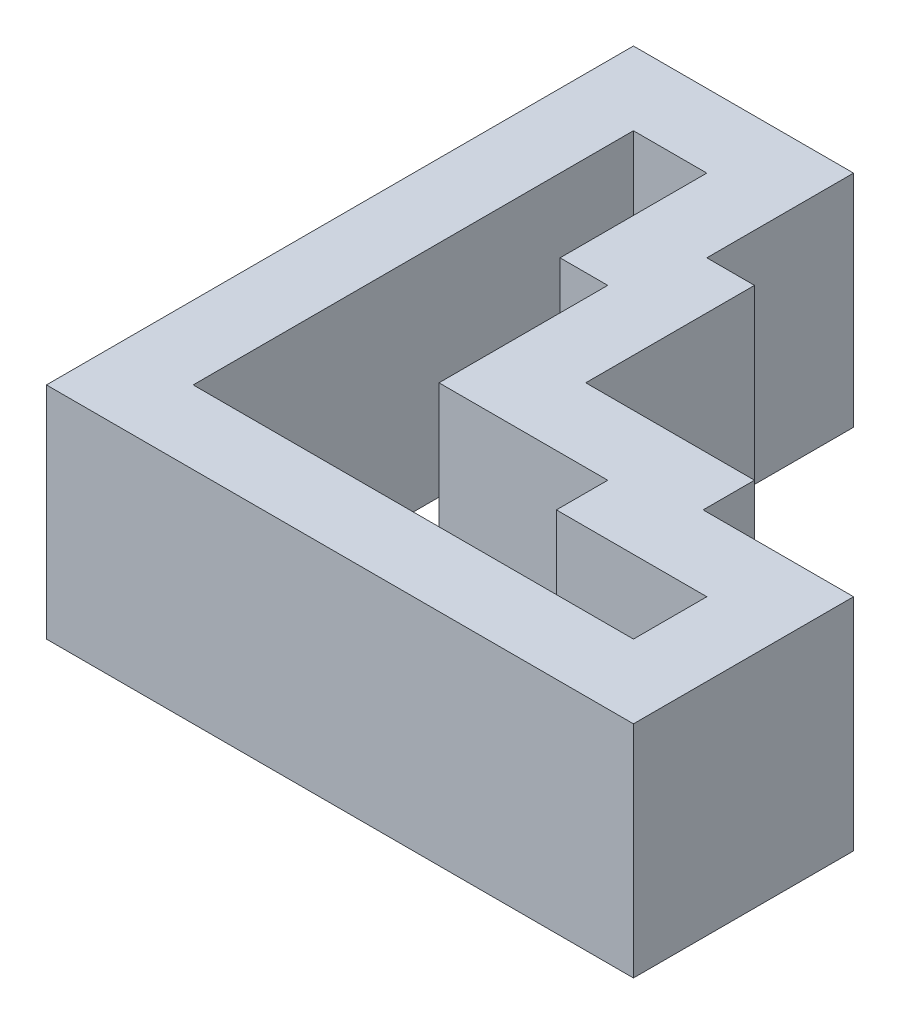
ISO-10303-21;
HEADER;
FILE_DESCRIPTION(('STEP AP214'),'2;1');
FILE_NAME('part.step','',(''),(''),'','','');
FILE_SCHEMA(('AUTOMOTIVE_DESIGN { 1 0 10303 214 1 1 1 1 }'));
ENDSEC;
DATA;
#1=APPLICATION_CONTEXT('core data for automotive mechanical design processes');
#2=APPLICATION_PROTOCOL_DEFINITION('international standard','automotive_design',2000,#1);
#3=PRODUCT_CONTEXT('',#1,'mechanical');
#4=PRODUCT('Part','Part','',(#3));
#5=PRODUCT_RELATED_PRODUCT_CATEGORY('part','',(#4));
#6=PRODUCT_DEFINITION_FORMATION('','',#4);
#7=PRODUCT_DEFINITION_CONTEXT('part definition',#1,'design');
#8=PRODUCT_DEFINITION('design','',#6,#7);
#9=PRODUCT_DEFINITION_SHAPE('','',#8);
#10=(LENGTH_UNIT() NAMED_UNIT(*) SI_UNIT(.MILLI.,.METRE.));
#11=(NAMED_UNIT(*) PLANE_ANGLE_UNIT() SI_UNIT($,.RADIAN.));
#12=(NAMED_UNIT(*) SI_UNIT($,.STERADIAN.) SOLID_ANGLE_UNIT());
#13=UNCERTAINTY_MEASURE_WITH_UNIT(LENGTH_MEASURE(1.E-05),#10,'distance_accuracy_value','');
#14=(GEOMETRIC_REPRESENTATION_CONTEXT(3) GLOBAL_UNCERTAINTY_ASSIGNED_CONTEXT((#13)) GLOBAL_UNIT_ASSIGNED_CONTEXT((#10,
#11,#12)) REPRESENTATION_CONTEXT('',''));
#15=CARTESIAN_POINT('',(0.,0.,0.));
#16=DIRECTION('',(0.,0.,1.));
#17=DIRECTION('',(1.,0.,0.));
#18=AXIS2_PLACEMENT_3D('',#15,#16,#17);
#19=CARTESIAN_POINT('',(0.,30.,0.));
#20=DIRECTION('',(0.,1.,0.));
#21=DIRECTION('',(0.,0.,1.));
#22=AXIS2_PLACEMENT_3D('',#19,#20,#21);
#23=PLANE('',#22);
#24=DIRECTION('',(0.,0.,1.));
#25=VECTOR('',#24,1.);
#26=CARTESIAN_POINT('',(-10.,30.,-60.));
#27=LINE('',#26,#25);
#28=CARTESIAN_POINT('',(-10.,30.,-70.));
#29=VERTEX_POINT('',#28);
#30=CARTESIAN_POINT('',(-10.,30.,10.));
#31=VERTEX_POINT('',#30);
#32=EDGE_CURVE('E314',#29,#31,#27,.T.);
#33=ORIENTED_EDGE('',*,*,#32,.T.);
#34=DIRECTION('',(1.,0.,0.));
#35=VECTOR('',#34,1.);
#36=CARTESIAN_POINT('',(0.,30.,10.));
#37=LINE('',#36,#35);
#38=CARTESIAN_POINT('',(70.,30.,10.));
#39=VERTEX_POINT('',#38);
#40=EDGE_CURVE('E317',#31,#39,#37,.T.);
#41=ORIENTED_EDGE('',*,*,#40,.T.);
#42=DIRECTION('',(0.,0.,-1.));
#43=VECTOR('',#42,1.);
#44=CARTESIAN_POINT('',(70.,30.,0.));
#45=LINE('',#44,#43);
#46=CARTESIAN_POINT('',(70.,30.,-20.));
#47=VERTEX_POINT('',#46);
#48=EDGE_CURVE('E320',#39,#47,#45,.T.);
#49=ORIENTED_EDGE('',*,*,#48,.T.);
#50=DIRECTION('',(-1.,0.,0.));
#51=VECTOR('',#50,1.);
#52=CARTESIAN_POINT('',(60.,30.,-20.));
#53=LINE('',#52,#51);
#54=CARTESIAN_POINT('',(49.5,30.,-20.));
#55=VERTEX_POINT('',#54);
#56=EDGE_CURVE('E322',#47,#55,#53,.T.);
#57=ORIENTED_EDGE('',*,*,#56,.T.);
#58=DIRECTION('',(0.,0.,-1.));
#59=VECTOR('',#58,1.);
#60=CARTESIAN_POINT('',(49.5,30.,-10.));
#61=LINE('',#60,#59);
#62=CARTESIAN_POINT('',(49.5,30.,-27.));
#63=VERTEX_POINT('',#62);
#64=EDGE_CURVE('E324',#55,#63,#61,.T.);
#65=ORIENTED_EDGE('',*,*,#64,.T.);
#66=DIRECTION('',(-1.,0.,0.));
#67=VECTOR('',#66,1.);
#68=CARTESIAN_POINT('',(39.5,30.,-27.));
#69=LINE('',#68,#67);
#70=CARTESIAN_POINT('',(26.5,30.,-27.));
#71=VERTEX_POINT('',#70);
#72=EDGE_CURVE('E326',#63,#71,#69,.T.);
#73=ORIENTED_EDGE('',*,*,#72,.T.);
#74=DIRECTION('',(0.,0.,-1.));
#75=VECTOR('',#74,1.);
#76=CARTESIAN_POINT('',(26.5,30.,-17.));
#77=LINE('',#76,#75);
#78=CARTESIAN_POINT('',(26.5,30.,-50.));
#79=VERTEX_POINT('',#78);
#80=EDGE_CURVE('E328',#71,#79,#77,.T.);
#81=ORIENTED_EDGE('',*,*,#80,.T.);
#82=DIRECTION('',(-1.,0.,0.));
#83=VECTOR('',#82,1.);
#84=CARTESIAN_POINT('',(16.5,30.,-50.));
#85=LINE('',#84,#83);
#86=CARTESIAN_POINT('',(20.,30.,-50.));
#87=VERTEX_POINT('',#86);
#88=EDGE_CURVE('E330',#79,#87,#85,.T.);
#89=ORIENTED_EDGE('',*,*,#88,.T.);
#90=DIRECTION('',(0.,0.,-1.));
#91=VECTOR('',#90,1.);
#92=CARTESIAN_POINT('',(20.,30.,-40.));
#93=LINE('',#92,#91);
#94=CARTESIAN_POINT('',(20.,30.,-70.));
#95=VERTEX_POINT('',#94);
#96=EDGE_CURVE('E332',#87,#95,#93,.T.);
#97=ORIENTED_EDGE('',*,*,#96,.T.);
#98=DIRECTION('',(-1.,0.,0.));
#99=VECTOR('',#98,1.);
#100=CARTESIAN_POINT('',(10.,30.,-70.));
#101=LINE('',#100,#99);
#102=EDGE_CURVE('E334',#95,#29,#101,.T.);
#103=ORIENTED_EDGE('',*,*,#102,.T.);
#104=EDGE_LOOP('',(#33,#41,#49,#57,#65,#73,#81,#89,#97,#103));
#105=FACE_BOUND('',#104,.T.);
#106=DIRECTION('',(1.,0.,0.));
#107=VECTOR('',#106,1.);
#108=CARTESIAN_POINT('',(0.,30.,0.));
#109=LINE('',#108,#107);
#110=CARTESIAN_POINT('',(0.,30.,0.));
#111=VERTEX_POINT('',#110);
#112=CARTESIAN_POINT('',(60.,30.,0.));
#113=VERTEX_POINT('',#112);
#114=EDGE_CURVE('E243',#111,#113,#109,.T.);
#115=ORIENTED_EDGE('',*,*,#114,.F.);
#116=DIRECTION('',(0.,0.,1.));
#117=VECTOR('',#116,1.);
#118=CARTESIAN_POINT('',(0.,30.,-60.));
#119=LINE('',#118,#117);
#120=CARTESIAN_POINT('',(0.,30.,-60.));
#121=VERTEX_POINT('',#120);
#122=EDGE_CURVE('E235',#121,#111,#119,.T.);
#123=ORIENTED_EDGE('',*,*,#122,.F.);
#124=DIRECTION('',(-1.,0.,0.));
#125=VECTOR('',#124,1.);
#126=CARTESIAN_POINT('',(10.,30.,-60.));
#127=LINE('',#126,#125);
#128=CARTESIAN_POINT('',(10.,30.,-60.));
#129=VERTEX_POINT('',#128);
#130=EDGE_CURVE('E272',#129,#121,#127,.T.);
#131=ORIENTED_EDGE('',*,*,#130,.F.);
#132=DIRECTION('',(0.,0.,-1.));
#133=VECTOR('',#132,1.);
#134=CARTESIAN_POINT('',(10.,30.,-40.));
#135=LINE('',#134,#133);
#136=CARTESIAN_POINT('',(10.,30.,-40.));
#137=VERTEX_POINT('',#136);
#138=EDGE_CURVE('E270',#137,#129,#135,.T.);
#139=ORIENTED_EDGE('',*,*,#138,.F.);
#140=DIRECTION('',(-1.,0.,0.));
#141=VECTOR('',#140,1.);
#142=CARTESIAN_POINT('',(16.5,30.,-40.));
#143=LINE('',#142,#141);
#144=CARTESIAN_POINT('',(16.5,30.,-40.));
#145=VERTEX_POINT('',#144);
#146=EDGE_CURVE('E268',#145,#137,#143,.T.);
#147=ORIENTED_EDGE('',*,*,#146,.F.);
#148=DIRECTION('',(0.,0.,-1.));
#149=VECTOR('',#148,1.);
#150=CARTESIAN_POINT('',(16.5,30.,-17.));
#151=LINE('',#150,#149);
#152=CARTESIAN_POINT('',(16.5,30.,-17.));
#153=VERTEX_POINT('',#152);
#154=EDGE_CURVE('E266',#153,#145,#151,.T.);
#155=ORIENTED_EDGE('',*,*,#154,.F.);
#156=DIRECTION('',(-1.,0.,0.));
#157=VECTOR('',#156,1.);
#158=CARTESIAN_POINT('',(39.5,30.,-17.));
#159=LINE('',#158,#157);
#160=CARTESIAN_POINT('',(39.5,30.,-17.));
#161=VERTEX_POINT('',#160);
#162=EDGE_CURVE('E264',#161,#153,#159,.T.);
#163=ORIENTED_EDGE('',*,*,#162,.F.);
#164=DIRECTION('',(0.,0.,-1.));
#165=VECTOR('',#164,1.);
#166=CARTESIAN_POINT('',(39.5,30.,-10.));
#167=LINE('',#166,#165);
#168=CARTESIAN_POINT('',(39.5,30.,-10.));
#169=VERTEX_POINT('',#168);
#170=EDGE_CURVE('E262',#169,#161,#167,.T.);
#171=ORIENTED_EDGE('',*,*,#170,.F.);
#172=DIRECTION('',(-1.,0.,0.));
#173=VECTOR('',#172,1.);
#174=CARTESIAN_POINT('',(60.,30.,-10.));
#175=LINE('',#174,#173);
#176=CARTESIAN_POINT('',(60.,30.,-10.));
#177=VERTEX_POINT('',#176);
#178=EDGE_CURVE('E258',#177,#169,#175,.T.);
#179=ORIENTED_EDGE('',*,*,#178,.F.);
#180=DIRECTION('',(0.,0.,-1.));
#181=VECTOR('',#180,1.);
#182=CARTESIAN_POINT('',(60.,30.,0.));
#183=LINE('',#182,#181);
#184=EDGE_CURVE('E256',#113,#177,#183,.T.);
#185=ORIENTED_EDGE('',*,*,#184,.F.);
#186=EDGE_LOOP('',(#115,#123,#131,#139,#147,#155,#163,#171,#179,#185));
#187=FACE_BOUND('',#186,.T.);
#188=ADVANCED_FACE('F98',(#105,#187),#23,.T.);
#189=CARTESIAN_POINT('',(0.,0.,0.));
#190=DIRECTION('',(0.,1.,0.));
#191=DIRECTION('',(0.,0.,1.));
#192=AXIS2_PLACEMENT_3D('',#189,#190,#191);
#193=PLANE('',#192);
#194=DIRECTION('',(0.,0.,1.));
#195=VECTOR('',#194,1.);
#196=CARTESIAN_POINT('',(-10.,0.,-60.));
#197=LINE('',#196,#195);
#198=CARTESIAN_POINT('',(-10.,0.,-70.));
#199=VERTEX_POINT('',#198);
#200=CARTESIAN_POINT('',(-10.,0.,10.));
#201=VERTEX_POINT('',#200);
#202=EDGE_CURVE('E251',#199,#201,#197,.T.);
#203=ORIENTED_EDGE('',*,*,#202,.F.);
#204=DIRECTION('',(-1.,0.,0.));
#205=VECTOR('',#204,1.);
#206=CARTESIAN_POINT('',(10.,0.,-70.));
#207=LINE('',#206,#205);
#208=CARTESIAN_POINT('',(20.,0.,-70.));
#209=VERTEX_POINT('',#208);
#210=EDGE_CURVE('E318',#209,#199,#207,.T.);
#211=ORIENTED_EDGE('',*,*,#210,.F.);
#212=DIRECTION('',(0.,0.,-1.));
#213=VECTOR('',#212,1.);
#214=CARTESIAN_POINT('',(20.,0.,-40.));
#215=LINE('',#214,#213);
#216=CARTESIAN_POINT('',(20.,0.,-50.));
#217=VERTEX_POINT('',#216);
#218=EDGE_CURVE('E353',#217,#209,#215,.T.);
#219=ORIENTED_EDGE('',*,*,#218,.F.);
#220=DIRECTION('',(-1.,0.,0.));
#221=VECTOR('',#220,1.);
#222=CARTESIAN_POINT('',(16.5,0.,-50.));
#223=LINE('',#222,#221);
#224=CARTESIAN_POINT('',(26.5,0.,-50.));
#225=VERTEX_POINT('',#224);
#226=EDGE_CURVE('E351',#225,#217,#223,.T.);
#227=ORIENTED_EDGE('',*,*,#226,.F.);
#228=DIRECTION('',(0.,0.,-1.));
#229=VECTOR('',#228,1.);
#230=CARTESIAN_POINT('',(26.5,0.,-17.));
#231=LINE('',#230,#229);
#232=CARTESIAN_POINT('',(26.5,0.,-27.));
#233=VERTEX_POINT('',#232);
#234=EDGE_CURVE('E349',#233,#225,#231,.T.);
#235=ORIENTED_EDGE('',*,*,#234,.F.);
#236=DIRECTION('',(-1.,0.,0.));
#237=VECTOR('',#236,1.);
#238=CARTESIAN_POINT('',(39.5,0.,-27.));
#239=LINE('',#238,#237);
#240=CARTESIAN_POINT('',(49.5,0.,-27.));
#241=VERTEX_POINT('',#240);
#242=EDGE_CURVE('E347',#241,#233,#239,.T.);
#243=ORIENTED_EDGE('',*,*,#242,.F.);
#244=DIRECTION('',(0.,0.,-1.));
#245=VECTOR('',#244,1.);
#246=CARTESIAN_POINT('',(49.5,0.,-10.));
#247=LINE('',#246,#245);
#248=CARTESIAN_POINT('',(49.5,0.,-20.));
#249=VERTEX_POINT('',#248);
#250=EDGE_CURVE('E345',#249,#241,#247,.T.);
#251=ORIENTED_EDGE('',*,*,#250,.F.);
#252=DIRECTION('',(-1.,0.,0.));
#253=VECTOR('',#252,1.);
#254=CARTESIAN_POINT('',(60.,0.,-20.));
#255=LINE('',#254,#253);
#256=CARTESIAN_POINT('',(70.,0.,-20.));
#257=VERTEX_POINT('',#256);
#258=EDGE_CURVE('E343',#257,#249,#255,.T.);
#259=ORIENTED_EDGE('',*,*,#258,.F.);
#260=DIRECTION('',(0.,0.,-1.));
#261=VECTOR('',#260,1.);
#262=CARTESIAN_POINT('',(70.,0.,0.));
#263=LINE('',#262,#261);
#264=CARTESIAN_POINT('',(70.,0.,10.));
#265=VERTEX_POINT('',#264);
#266=EDGE_CURVE('E341',#265,#257,#263,.T.);
#267=ORIENTED_EDGE('',*,*,#266,.F.);
#268=DIRECTION('',(1.,0.,0.));
#269=VECTOR('',#268,1.);
#270=CARTESIAN_POINT('',(0.,0.,10.));
#271=LINE('',#270,#269);
#272=EDGE_CURVE('E339',#201,#265,#271,.T.);
#273=ORIENTED_EDGE('',*,*,#272,.F.);
#274=EDGE_LOOP('',(#203,#211,#219,#227,#235,#243,#251,#259,#267,#273));
#275=FACE_BOUND('',#274,.T.);
#276=DIRECTION('',(0.,0.,1.));
#277=VECTOR('',#276,1.);
#278=CARTESIAN_POINT('',(0.,0.,-60.));
#279=LINE('',#278,#277);
#280=CARTESIAN_POINT('',(0.,0.,-60.));
#281=VERTEX_POINT('',#280);
#282=CARTESIAN_POINT('',(0.,0.,0.));
#283=VERTEX_POINT('',#282);
#284=EDGE_CURVE('E121',#281,#283,#279,.T.);
#285=ORIENTED_EDGE('',*,*,#284,.T.);
#286=DIRECTION('',(1.,0.,0.));
#287=VECTOR('',#286,1.);
#288=CARTESIAN_POINT('',(0.,0.,0.));
#289=LINE('',#288,#287);
#290=CARTESIAN_POINT('',(60.,0.,0.));
#291=VERTEX_POINT('',#290);
#292=EDGE_CURVE('E250',#283,#291,#289,.T.);
#293=ORIENTED_EDGE('',*,*,#292,.T.);
#294=DIRECTION('',(0.,0.,-1.));
#295=VECTOR('',#294,1.);
#296=CARTESIAN_POINT('',(60.,0.,0.));
#297=LINE('',#296,#295);
#298=CARTESIAN_POINT('',(60.,0.,-10.));
#299=VERTEX_POINT('',#298);
#300=EDGE_CURVE('E276',#291,#299,#297,.T.);
#301=ORIENTED_EDGE('',*,*,#300,.T.);
#302=DIRECTION('',(-1.,0.,0.));
#303=VECTOR('',#302,1.);
#304=CARTESIAN_POINT('',(60.,0.,-10.));
#305=LINE('',#304,#303);
#306=CARTESIAN_POINT('',(39.5,0.,-10.));
#307=VERTEX_POINT('',#306);
#308=EDGE_CURVE('E279',#299,#307,#305,.T.);
#309=ORIENTED_EDGE('',*,*,#308,.T.);
#310=DIRECTION('',(0.,0.,-1.));
#311=VECTOR('',#310,1.);
#312=CARTESIAN_POINT('',(39.5,0.,-10.));
#313=LINE('',#312,#311);
#314=CARTESIAN_POINT('',(39.5,0.,-17.));
#315=VERTEX_POINT('',#314);
#316=EDGE_CURVE('E282',#307,#315,#313,.T.);
#317=ORIENTED_EDGE('',*,*,#316,.T.);
#318=DIRECTION('',(-1.,0.,0.));
#319=VECTOR('',#318,1.);
#320=CARTESIAN_POINT('',(39.5,0.,-17.));
#321=LINE('',#320,#319);
#322=CARTESIAN_POINT('',(16.5,0.,-17.));
#323=VERTEX_POINT('',#322);
#324=EDGE_CURVE('E285',#315,#323,#321,.T.);
#325=ORIENTED_EDGE('',*,*,#324,.T.);
#326=DIRECTION('',(0.,0.,-1.));
#327=VECTOR('',#326,1.);
#328=CARTESIAN_POINT('',(16.5,0.,-17.));
#329=LINE('',#328,#327);
#330=CARTESIAN_POINT('',(16.5,0.,-40.));
#331=VERTEX_POINT('',#330);
#332=EDGE_CURVE('E288',#323,#331,#329,.T.);
#333=ORIENTED_EDGE('',*,*,#332,.T.);
#334=DIRECTION('',(-1.,0.,0.));
#335=VECTOR('',#334,1.);
#336=CARTESIAN_POINT('',(16.5,0.,-40.));
#337=LINE('',#336,#335);
#338=CARTESIAN_POINT('',(10.,0.,-40.));
#339=VERTEX_POINT('',#338);
#340=EDGE_CURVE('E291',#331,#339,#337,.T.);
#341=ORIENTED_EDGE('',*,*,#340,.T.);
#342=DIRECTION('',(0.,0.,-1.));
#343=VECTOR('',#342,1.);
#344=CARTESIAN_POINT('',(10.,0.,-40.));
#345=LINE('',#344,#343);
#346=CARTESIAN_POINT('',(10.,0.,-60.));
#347=VERTEX_POINT('',#346);
#348=EDGE_CURVE('E294',#339,#347,#345,.T.);
#349=ORIENTED_EDGE('',*,*,#348,.T.);
#350=DIRECTION('',(-1.,0.,0.));
#351=VECTOR('',#350,1.);
#352=CARTESIAN_POINT('',(10.,0.,-60.));
#353=LINE('',#352,#351);
#354=EDGE_CURVE('E244',#347,#281,#353,.T.);
#355=ORIENTED_EDGE('',*,*,#354,.T.);
#356=EDGE_LOOP('',(#285,#293,#301,#309,#317,#325,#333,#341,#349,#355));
#357=FACE_BOUND('',#356,.T.);
#358=ADVANCED_FACE('F389',(#275,#357),#193,.F.);
#359=CARTESIAN_POINT('',(-10.,30.,-60.));
#360=DIRECTION('',(1.,0.,0.));
#361=DIRECTION('',(0.,0.,-1.));
#362=AXIS2_PLACEMENT_3D('',#359,#360,#361);
#363=PLANE('',#362);
#364=ORIENTED_EDGE('',*,*,#202,.T.);
#365=DIRECTION('',(0.,-1.,0.));
#366=VECTOR('',#365,1.);
#367=CARTESIAN_POINT('',(-10.,30.,10.));
#368=LINE('',#367,#366);
#369=EDGE_CURVE('E12',#31,#201,#368,.T.);
#370=ORIENTED_EDGE('',*,*,#369,.F.);
#371=ORIENTED_EDGE('',*,*,#32,.F.);
#372=DIRECTION('',(0.,-1.,0.));
#373=VECTOR('',#372,1.);
#374=CARTESIAN_POINT('',(-10.,30.,-70.));
#375=LINE('',#374,#373);
#376=EDGE_CURVE('E336',#29,#199,#375,.T.);
#377=ORIENTED_EDGE('',*,*,#376,.T.);
#378=EDGE_LOOP('',(#364,#370,#371,#377));
#379=FACE_BOUND('',#378,.T.);
#380=ADVANCED_FACE('F100',(#379),#363,.F.);
#381=CARTESIAN_POINT('',(0.,30.,10.));
#382=DIRECTION('',(0.,0.,-1.));
#383=DIRECTION('',(-1.,0.,0.));
#384=AXIS2_PLACEMENT_3D('',#381,#382,#383);
#385=PLANE('',#384);
#386=ORIENTED_EDGE('',*,*,#272,.T.);
#387=DIRECTION('',(0.,-1.,0.));
#388=VECTOR('',#387,1.);
#389=CARTESIAN_POINT('',(70.,30.,10.));
#390=LINE('',#389,#388);
#391=EDGE_CURVE('E106',#39,#265,#390,.T.);
#392=ORIENTED_EDGE('',*,*,#391,.F.);
#393=ORIENTED_EDGE('',*,*,#40,.F.);
#394=ORIENTED_EDGE('',*,*,#369,.T.);
#395=EDGE_LOOP('',(#386,#392,#393,#394));
#396=FACE_BOUND('',#395,.T.);
#397=ADVANCED_FACE('F406',(#396),#385,.F.);
#398=CARTESIAN_POINT('',(70.,30.,0.));
#399=DIRECTION('',(-1.,0.,0.));
#400=DIRECTION('',(0.,0.,1.));
#401=AXIS2_PLACEMENT_3D('',#398,#399,#400);
#402=PLANE('',#401);
#403=ORIENTED_EDGE('',*,*,#266,.T.);
#404=DIRECTION('',(0.,-1.,0.));
#405=VECTOR('',#404,1.);
#406=CARTESIAN_POINT('',(70.,30.,-20.));
#407=LINE('',#406,#405);
#408=EDGE_CURVE('E376',#47,#257,#407,.T.);
#409=ORIENTED_EDGE('',*,*,#408,.F.);
#410=ORIENTED_EDGE('',*,*,#48,.F.);
#411=ORIENTED_EDGE('',*,*,#391,.T.);
#412=EDGE_LOOP('',(#403,#409,#410,#411));
#413=FACE_BOUND('',#412,.T.);
#414=ADVANCED_FACE('F383',(#413),#402,.F.);
#415=CARTESIAN_POINT('',(60.,30.,-20.));
#416=DIRECTION('',(0.,0.,1.));
#417=DIRECTION('',(1.,0.,0.));
#418=AXIS2_PLACEMENT_3D('',#415,#416,#417);
#419=PLANE('',#418);
#420=ORIENTED_EDGE('',*,*,#258,.T.);
#421=DIRECTION('',(0.,-1.,0.));
#422=VECTOR('',#421,1.);
#423=CARTESIAN_POINT('',(49.5,30.,-20.));
#424=LINE('',#423,#422);
#425=EDGE_CURVE('E373',#55,#249,#424,.T.);
#426=ORIENTED_EDGE('',*,*,#425,.F.);
#427=ORIENTED_EDGE('',*,*,#56,.F.);
#428=ORIENTED_EDGE('',*,*,#408,.T.);
#429=EDGE_LOOP('',(#420,#426,#427,#428));
#430=FACE_BOUND('',#429,.T.);
#431=ADVANCED_FACE('F395',(#430),#419,.F.);
#432=CARTESIAN_POINT('',(49.5,30.,-10.));
#433=DIRECTION('',(-1.,0.,0.));
#434=DIRECTION('',(0.,0.,1.));
#435=AXIS2_PLACEMENT_3D('',#432,#433,#434);
#436=PLANE('',#435);
#437=ORIENTED_EDGE('',*,*,#250,.T.);
#438=DIRECTION('',(0.,-1.,0.));
#439=VECTOR('',#438,1.);
#440=CARTESIAN_POINT('',(49.5,30.,-27.));
#441=LINE('',#440,#439);
#442=EDGE_CURVE('E370',#63,#241,#441,.T.);
#443=ORIENTED_EDGE('',*,*,#442,.F.);
#444=ORIENTED_EDGE('',*,*,#64,.F.);
#445=ORIENTED_EDGE('',*,*,#425,.T.);
#446=EDGE_LOOP('',(#437,#443,#444,#445));
#447=FACE_BOUND('',#446,.T.);
#448=ADVANCED_FACE('F399',(#447),#436,.F.);
#449=CARTESIAN_POINT('',(39.5,30.,-27.));
#450=DIRECTION('',(0.,0.,1.));
#451=DIRECTION('',(1.,0.,0.));
#452=AXIS2_PLACEMENT_3D('',#449,#450,#451);
#453=PLANE('',#452);
#454=ORIENTED_EDGE('',*,*,#242,.T.);
#455=DIRECTION('',(0.,-1.,0.));
#456=VECTOR('',#455,1.);
#457=CARTESIAN_POINT('',(26.5,30.,-27.));
#458=LINE('',#457,#456);
#459=EDGE_CURVE('E367',#71,#233,#458,.T.);
#460=ORIENTED_EDGE('',*,*,#459,.F.);
#461=ORIENTED_EDGE('',*,*,#72,.F.);
#462=ORIENTED_EDGE('',*,*,#442,.T.);
#463=EDGE_LOOP('',(#454,#460,#461,#462));
#464=FACE_BOUND('',#463,.T.);
#465=ADVANCED_FACE('F429',(#464),#453,.F.);
#466=CARTESIAN_POINT('',(26.5,30.,-17.));
#467=DIRECTION('',(-1.,0.,0.));
#468=DIRECTION('',(0.,0.,1.));
#469=AXIS2_PLACEMENT_3D('',#466,#467,#468);
#470=PLANE('',#469);
#471=ORIENTED_EDGE('',*,*,#234,.T.);
#472=DIRECTION('',(0.,-1.,0.));
#473=VECTOR('',#472,1.);
#474=CARTESIAN_POINT('',(26.5,30.,-50.));
#475=LINE('',#474,#473);
#476=EDGE_CURVE('E364',#79,#225,#475,.T.);
#477=ORIENTED_EDGE('',*,*,#476,.F.);
#478=ORIENTED_EDGE('',*,*,#80,.F.);
#479=ORIENTED_EDGE('',*,*,#459,.T.);
#480=EDGE_LOOP('',(#471,#477,#478,#479));
#481=FACE_BOUND('',#480,.T.);
#482=ADVANCED_FACE('F426',(#481),#470,.F.);
#483=CARTESIAN_POINT('',(16.5,30.,-50.));
#484=DIRECTION('',(0.,0.,1.));
#485=DIRECTION('',(1.,0.,0.));
#486=AXIS2_PLACEMENT_3D('',#483,#484,#485);
#487=PLANE('',#486);
#488=ORIENTED_EDGE('',*,*,#226,.T.);
#489=DIRECTION('',(0.,-1.,0.));
#490=VECTOR('',#489,1.);
#491=CARTESIAN_POINT('',(20.,30.,-50.));
#492=LINE('',#491,#490);
#493=EDGE_CURVE('E361',#87,#217,#492,.T.);
#494=ORIENTED_EDGE('',*,*,#493,.F.);
#495=ORIENTED_EDGE('',*,*,#88,.F.);
#496=ORIENTED_EDGE('',*,*,#476,.T.);
#497=EDGE_LOOP('',(#488,#494,#495,#496));
#498=FACE_BOUND('',#497,.T.);
#499=ADVANCED_FACE('F422',(#498),#487,.F.);
#500=CARTESIAN_POINT('',(20.,30.,-40.));
#501=DIRECTION('',(-1.,0.,0.));
#502=DIRECTION('',(0.,0.,1.));
#503=AXIS2_PLACEMENT_3D('',#500,#501,#502);
#504=PLANE('',#503);
#505=ORIENTED_EDGE('',*,*,#218,.T.);
#506=DIRECTION('',(0.,-1.,0.));
#507=VECTOR('',#506,1.);
#508=CARTESIAN_POINT('',(20.,30.,-70.));
#509=LINE('',#508,#507);
#510=EDGE_CURVE('E358',#95,#209,#509,.T.);
#511=ORIENTED_EDGE('',*,*,#510,.F.);
#512=ORIENTED_EDGE('',*,*,#96,.F.);
#513=ORIENTED_EDGE('',*,*,#493,.T.);
#514=EDGE_LOOP('',(#505,#511,#512,#513));
#515=FACE_BOUND('',#514,.T.);
#516=ADVANCED_FACE('F418',(#515),#504,.F.);
#517=CARTESIAN_POINT('',(10.,30.,-70.));
#518=DIRECTION('',(0.,0.,1.));
#519=DIRECTION('',(1.,0.,0.));
#520=AXIS2_PLACEMENT_3D('',#517,#518,#519);
#521=PLANE('',#520);
#522=ORIENTED_EDGE('',*,*,#210,.T.);
#523=ORIENTED_EDGE('',*,*,#376,.F.);
#524=ORIENTED_EDGE('',*,*,#102,.F.);
#525=ORIENTED_EDGE('',*,*,#510,.T.);
#526=EDGE_LOOP('',(#522,#523,#524,#525));
#527=FACE_BOUND('',#526,.T.);
#528=ADVANCED_FACE('F413',(#527),#521,.F.);
#529=CARTESIAN_POINT('',(0.,30.,-60.));
#530=DIRECTION('',(1.,0.,0.));
#531=DIRECTION('',(0.,0.,-1.));
#532=AXIS2_PLACEMENT_3D('',#529,#530,#531);
#533=PLANE('',#532);
#534=ORIENTED_EDGE('',*,*,#284,.F.);
#535=DIRECTION('',(0.,-1.,0.));
#536=VECTOR('',#535,1.);
#537=CARTESIAN_POINT('',(0.,30.,-60.));
#538=LINE('',#537,#536);
#539=EDGE_CURVE('E239',#121,#281,#538,.T.);
#540=ORIENTED_EDGE('',*,*,#539,.F.);
#541=ORIENTED_EDGE('',*,*,#122,.T.);
#542=DIRECTION('',(0.,-1.,0.));
#543=VECTOR('',#542,1.);
#544=CARTESIAN_POINT('',(0.,30.,0.));
#545=LINE('',#544,#543);
#546=EDGE_CURVE('E238',#111,#283,#545,.T.);
#547=ORIENTED_EDGE('',*,*,#546,.T.);
#548=EDGE_LOOP('',(#534,#540,#541,#547));
#549=FACE_BOUND('',#548,.T.);
#550=ADVANCED_FACE('F237',(#549),#533,.T.);
#551=CARTESIAN_POINT('',(0.,30.,0.));
#552=DIRECTION('',(0.,0.,-1.));
#553=DIRECTION('',(-1.,0.,0.));
#554=AXIS2_PLACEMENT_3D('',#551,#552,#553);
#555=PLANE('',#554);
#556=ORIENTED_EDGE('',*,*,#292,.F.);
#557=ORIENTED_EDGE('',*,*,#546,.F.);
#558=ORIENTED_EDGE('',*,*,#114,.T.);
#559=DIRECTION('',(0.,-1.,0.));
#560=VECTOR('',#559,1.);
#561=CARTESIAN_POINT('',(60.,30.,0.));
#562=LINE('',#561,#560);
#563=EDGE_CURVE('E252',#113,#291,#562,.T.);
#564=ORIENTED_EDGE('',*,*,#563,.T.);
#565=EDGE_LOOP('',(#556,#557,#558,#564));
#566=FACE_BOUND('',#565,.T.);
#567=ADVANCED_FACE('F247',(#566),#555,.T.);
#568=CARTESIAN_POINT('',(60.,30.,0.));
#569=DIRECTION('',(-1.,0.,0.));
#570=DIRECTION('',(0.,0.,1.));
#571=AXIS2_PLACEMENT_3D('',#568,#569,#570);
#572=PLANE('',#571);
#573=ORIENTED_EDGE('',*,*,#300,.F.);
#574=ORIENTED_EDGE('',*,*,#563,.F.);
#575=ORIENTED_EDGE('',*,*,#184,.T.);
#576=DIRECTION('',(0.,-1.,0.));
#577=VECTOR('',#576,1.);
#578=CARTESIAN_POINT('',(60.,30.,-10.));
#579=LINE('',#578,#577);
#580=EDGE_CURVE('E311',#177,#299,#579,.T.);
#581=ORIENTED_EDGE('',*,*,#580,.T.);
#582=EDGE_LOOP('',(#573,#574,#575,#581));
#583=FACE_BOUND('',#582,.T.);
#584=ADVANCED_FACE('F475',(#583),#572,.T.);
#585=CARTESIAN_POINT('',(60.,30.,-10.));
#586=DIRECTION('',(0.,0.,1.));
#587=DIRECTION('',(1.,0.,0.));
#588=AXIS2_PLACEMENT_3D('',#585,#586,#587);
#589=PLANE('',#588);
#590=ORIENTED_EDGE('',*,*,#308,.F.);
#591=ORIENTED_EDGE('',*,*,#580,.F.);
#592=ORIENTED_EDGE('',*,*,#178,.T.);
#593=DIRECTION('',(0.,-1.,0.));
#594=VECTOR('',#593,1.);
#595=CARTESIAN_POINT('',(39.5,30.,-10.));
#596=LINE('',#595,#594);
#597=EDGE_CURVE('E309',#169,#307,#596,.T.);
#598=ORIENTED_EDGE('',*,*,#597,.T.);
#599=EDGE_LOOP('',(#590,#591,#592,#598));
#600=FACE_BOUND('',#599,.T.);
#601=ADVANCED_FACE('F481',(#600),#589,.T.);
#602=CARTESIAN_POINT('',(39.5,30.,-10.));
#603=DIRECTION('',(-1.,0.,0.));
#604=DIRECTION('',(0.,0.,1.));
#605=AXIS2_PLACEMENT_3D('',#602,#603,#604);
#606=PLANE('',#605);
#607=ORIENTED_EDGE('',*,*,#316,.F.);
#608=ORIENTED_EDGE('',*,*,#597,.F.);
#609=ORIENTED_EDGE('',*,*,#170,.T.);
#610=DIRECTION('',(0.,-1.,0.));
#611=VECTOR('',#610,1.);
#612=CARTESIAN_POINT('',(39.5,30.,-17.));
#613=LINE('',#612,#611);
#614=EDGE_CURVE('E307',#161,#315,#613,.T.);
#615=ORIENTED_EDGE('',*,*,#614,.T.);
#616=EDGE_LOOP('',(#607,#608,#609,#615));
#617=FACE_BOUND('',#616,.T.);
#618=ADVANCED_FACE('F489',(#617),#606,.T.);
#619=CARTESIAN_POINT('',(39.5,30.,-17.));
#620=DIRECTION('',(0.,0.,1.));
#621=DIRECTION('',(1.,0.,0.));
#622=AXIS2_PLACEMENT_3D('',#619,#620,#621);
#623=PLANE('',#622);
#624=ORIENTED_EDGE('',*,*,#324,.F.);
#625=ORIENTED_EDGE('',*,*,#614,.F.);
#626=ORIENTED_EDGE('',*,*,#162,.T.);
#627=DIRECTION('',(0.,-1.,0.));
#628=VECTOR('',#627,1.);
#629=CARTESIAN_POINT('',(16.5,30.,-17.));
#630=LINE('',#629,#628);
#631=EDGE_CURVE('E305',#153,#323,#630,.T.);
#632=ORIENTED_EDGE('',*,*,#631,.T.);
#633=EDGE_LOOP('',(#624,#625,#626,#632));
#634=FACE_BOUND('',#633,.T.);
#635=ADVANCED_FACE('F497',(#634),#623,.T.);
#636=CARTESIAN_POINT('',(16.5,30.,-17.));
#637=DIRECTION('',(-1.,0.,0.));
#638=DIRECTION('',(0.,0.,1.));
#639=AXIS2_PLACEMENT_3D('',#636,#637,#638);
#640=PLANE('',#639);
#641=ORIENTED_EDGE('',*,*,#332,.F.);
#642=ORIENTED_EDGE('',*,*,#631,.F.);
#643=ORIENTED_EDGE('',*,*,#154,.T.);
#644=DIRECTION('',(0.,-1.,0.));
#645=VECTOR('',#644,1.);
#646=CARTESIAN_POINT('',(16.5,30.,-40.));
#647=LINE('',#646,#645);
#648=EDGE_CURVE('E303',#145,#331,#647,.T.);
#649=ORIENTED_EDGE('',*,*,#648,.T.);
#650=EDGE_LOOP('',(#641,#642,#643,#649));
#651=FACE_BOUND('',#650,.T.);
#652=ADVANCED_FACE('F505',(#651),#640,.T.);
#653=CARTESIAN_POINT('',(16.5,30.,-40.));
#654=DIRECTION('',(0.,0.,1.));
#655=DIRECTION('',(1.,0.,0.));
#656=AXIS2_PLACEMENT_3D('',#653,#654,#655);
#657=PLANE('',#656);
#658=ORIENTED_EDGE('',*,*,#340,.F.);
#659=ORIENTED_EDGE('',*,*,#648,.F.);
#660=ORIENTED_EDGE('',*,*,#146,.T.);
#661=DIRECTION('',(0.,-1.,0.));
#662=VECTOR('',#661,1.);
#663=CARTESIAN_POINT('',(10.,30.,-40.));
#664=LINE('',#663,#662);
#665=EDGE_CURVE('E301',#137,#339,#664,.T.);
#666=ORIENTED_EDGE('',*,*,#665,.T.);
#667=EDGE_LOOP('',(#658,#659,#660,#666));
#668=FACE_BOUND('',#667,.T.);
#669=ADVANCED_FACE('F513',(#668),#657,.T.);
#670=CARTESIAN_POINT('',(10.,30.,-40.));
#671=DIRECTION('',(-1.,0.,0.));
#672=DIRECTION('',(0.,0.,1.));
#673=AXIS2_PLACEMENT_3D('',#670,#671,#672);
#674=PLANE('',#673);
#675=ORIENTED_EDGE('',*,*,#348,.F.);
#676=ORIENTED_EDGE('',*,*,#665,.F.);
#677=ORIENTED_EDGE('',*,*,#138,.T.);
#678=DIRECTION('',(0.,-1.,0.));
#679=VECTOR('',#678,1.);
#680=CARTESIAN_POINT('',(10.,30.,-60.));
#681=LINE('',#680,#679);
#682=EDGE_CURVE('E113',#129,#347,#681,.T.);
#683=ORIENTED_EDGE('',*,*,#682,.T.);
#684=EDGE_LOOP('',(#675,#676,#677,#683));
#685=FACE_BOUND('',#684,.T.);
#686=ADVANCED_FACE('F521',(#685),#674,.T.);
#687=CARTESIAN_POINT('',(10.,30.,-60.));
#688=DIRECTION('',(0.,0.,1.));
#689=DIRECTION('',(1.,0.,0.));
#690=AXIS2_PLACEMENT_3D('',#687,#688,#689);
#691=PLANE('',#690);
#692=ORIENTED_EDGE('',*,*,#354,.F.);
#693=ORIENTED_EDGE('',*,*,#682,.F.);
#694=ORIENTED_EDGE('',*,*,#130,.T.);
#695=ORIENTED_EDGE('',*,*,#539,.T.);
#696=EDGE_LOOP('',(#692,#693,#694,#695));
#697=FACE_BOUND('',#696,.T.);
#698=ADVANCED_FACE('F529',(#697),#691,.T.);
#699=CLOSED_SHELL('',(#188,#358,#380,#397,#414,#431,#448,#465,#482,#499,#516,#528,#550,#567,
#584,#601,#618,#635,#652,#669,#686,#698));
#700=MANIFOLD_SOLID_BREP('B2',#699);
#701=ADVANCED_BREP_SHAPE_REPRESENTATION('',(#18,#700),#14);
#702=SHAPE_DEFINITION_REPRESENTATION(#9,#701);
ENDSEC;
END-ISO-10303-21;
